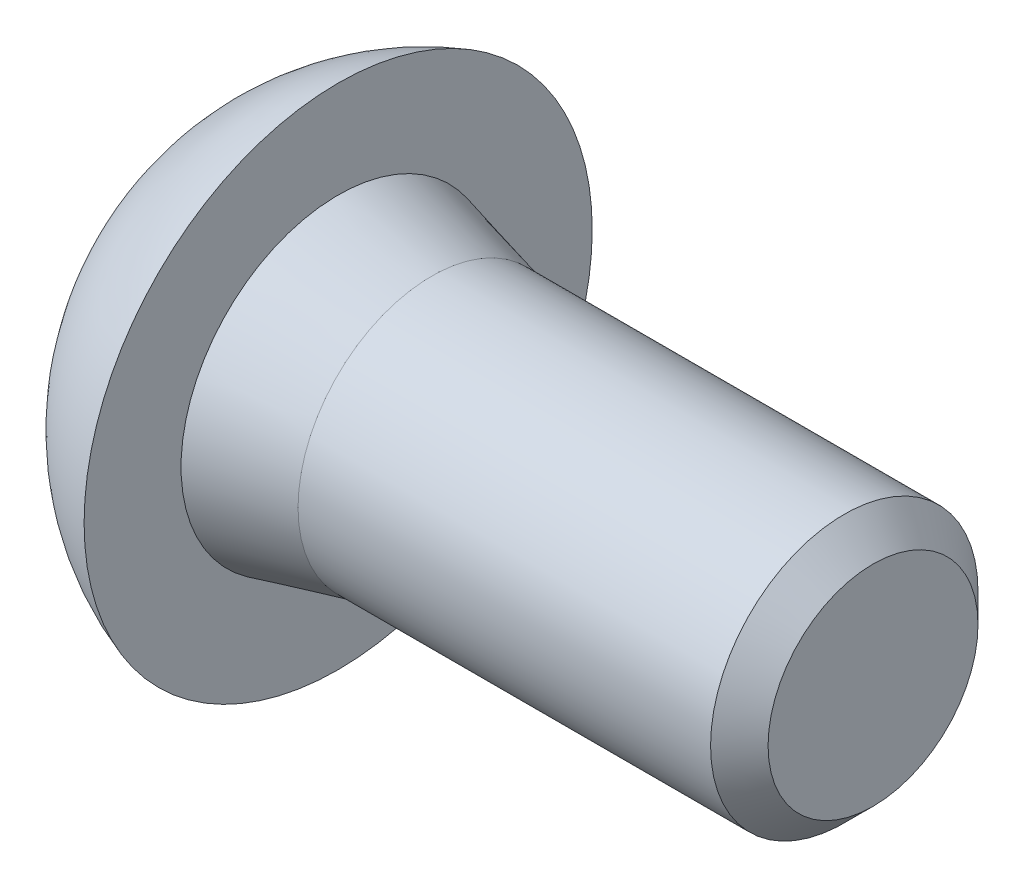
ISO-10303-21;
HEADER;
FILE_DESCRIPTION(('STEP AP214'),'2;1');
FILE_NAME('part.step','',(''),(''),'','','');
FILE_SCHEMA(('AUTOMOTIVE_DESIGN { 1 0 10303 214 1 1 1 1 }'));
ENDSEC;
DATA;
#1=APPLICATION_CONTEXT('core data for automotive mechanical design processes');
#2=APPLICATION_PROTOCOL_DEFINITION('international standard','automotive_design',2000,#1);
#3=PRODUCT_CONTEXT('',#1,'mechanical');
#4=PRODUCT('Part','Part','',(#3));
#5=PRODUCT_RELATED_PRODUCT_CATEGORY('part','',(#4));
#6=PRODUCT_DEFINITION_FORMATION('','',#4);
#7=PRODUCT_DEFINITION_CONTEXT('part definition',#1,'design');
#8=PRODUCT_DEFINITION('design','',#6,#7);
#9=PRODUCT_DEFINITION_SHAPE('','',#8);
#10=(LENGTH_UNIT() NAMED_UNIT(*) SI_UNIT(.MILLI.,.METRE.));
#11=(NAMED_UNIT(*) PLANE_ANGLE_UNIT() SI_UNIT($,.RADIAN.));
#12=(NAMED_UNIT(*) SI_UNIT($,.STERADIAN.) SOLID_ANGLE_UNIT());
#13=UNCERTAINTY_MEASURE_WITH_UNIT(LENGTH_MEASURE(1.E-05),#10,'distance_accuracy_value','');
#14=(GEOMETRIC_REPRESENTATION_CONTEXT(3) GLOBAL_UNCERTAINTY_ASSIGNED_CONTEXT((#13)) GLOBAL_UNIT_ASSIGNED_CONTEXT((#10,
#11,#12)) REPRESENTATION_CONTEXT('',''));
#15=CARTESIAN_POINT('',(0.,0.,0.));
#16=DIRECTION('',(0.,0.,1.));
#17=DIRECTION('',(1.,0.,0.));
#18=AXIS2_PLACEMENT_3D('',#15,#16,#17);
#19=CARTESIAN_POINT('',(-2.19999999999998,1.24999999999964,2.22044604925031E-13));
#20=DIRECTION('',(1.,0.,0.));
#21=DIRECTION('',(0.,0.,-1.));
#22=AXIS2_PLACEMENT_3D('',#19,#20,#21);
#23=PLANE('',#22);
#24=CARTESIAN_POINT('',(-2.19999999999998,0.,0.));
#25=DIRECTION('',(1.,0.,0.));
#26=DIRECTION('',(0.,0.,-1.));
#27=AXIS2_PLACEMENT_3D('',#24,#25,#26);
#28=CIRCLE('',#27,1.9);
#29=CARTESIAN_POINT('',(-2.19999999999998,0.,-1.9));
#30=VERTEX_POINT('',#29);
#31=EDGE_CURVE('E134',#30,#30,#28,.T.);
#32=ORIENTED_EDGE('',*,*,#31,.F.);
#33=EDGE_LOOP('',(#32));
#34=FACE_BOUND('',#33,.T.);
#35=DIRECTION('',(0.,-0.5,0.86602540378444));
#36=VECTOR('',#35,1.);
#37=CARTESIAN_POINT('',(-2.19999999999998,-0.770031754729894,-1.16626587736507));
#38=LINE('',#37,#36);
#39=CARTESIAN_POINT('',(-2.19999999999998,-0.721687836486962,-1.24999999999981));
#40=VERTEX_POINT('',#39);
#41=CARTESIAN_POINT('',(-2.19999999999998,-1.44337567297403,-1.11022302462516E-13));
#42=VERTEX_POINT('',#41);
#43=EDGE_CURVE('E11',#40,#42,#38,.T.);
#44=ORIENTED_EDGE('',*,*,#43,.F.);
#45=DIRECTION('',(0.,-1.,0.));
#46=VECTOR('',#45,1.);
#47=CARTESIAN_POINT('',(-2.19999999999998,1.2500000000002,-1.24999999999981));
#48=LINE('',#47,#46);
#49=CARTESIAN_POINT('',(-2.19999999999998,0.721687836487073,-1.24999999999981));
#50=VERTEX_POINT('',#49);
#51=EDGE_CURVE('E152',#50,#40,#48,.T.);
#52=ORIENTED_EDGE('',*,*,#51,.F.);
#53=DIRECTION('',(0.,-0.5,-0.86602540378444));
#54=VECTOR('',#53,1.);
#55=CARTESIAN_POINT('',(-2.19999999999998,1.39503175473077,-0.0837341226347932));
#56=LINE('',#55,#54);
#57=CARTESIAN_POINT('',(-2.19999999999998,1.44337567297403,2.22044604925031E-13));
#58=VERTEX_POINT('',#57);
#59=EDGE_CURVE('E148',#58,#50,#56,.T.);
#60=ORIENTED_EDGE('',*,*,#59,.F.);
#61=DIRECTION('',(0.,0.5,-0.86602540378444));
#62=VECTOR('',#61,1.);
#63=CARTESIAN_POINT('',(-2.19999999999998,1.39503175473044,0.0837341226349042));
#64=LINE('',#63,#62);
#65=CARTESIAN_POINT('',(-2.19999999999998,0.721687836487295,1.25000000000003));
#66=VERTEX_POINT('',#65);
#67=EDGE_CURVE('E146',#66,#58,#64,.T.);
#68=ORIENTED_EDGE('',*,*,#67,.F.);
#69=DIRECTION('',(0.,1.,0.));
#70=VECTOR('',#69,1.);
#71=CARTESIAN_POINT('',(-2.19999999999998,1.2500000000002,1.25000000000008));
#72=LINE('',#71,#70);
#73=CARTESIAN_POINT('',(-2.19999999999998,-0.72168783648674,1.24999999999992));
#74=VERTEX_POINT('',#73);
#75=EDGE_CURVE('E150',#74,#66,#72,.T.);
#76=ORIENTED_EDGE('',*,*,#75,.F.);
#77=DIRECTION('',(0.,0.5,0.86602540378444));
#78=VECTOR('',#77,1.);
#79=CARTESIAN_POINT('',(-2.19999999999998,-0.770031754730116,1.16626587736562));
#80=LINE('',#79,#78);
#81=EDGE_CURVE('E24',#42,#74,#80,.T.);
#82=ORIENTED_EDGE('',*,*,#81,.F.);
#83=EDGE_LOOP('',(#44,#52,#60,#68,#76,#82));
#84=FACE_BOUND('',#83,.T.);
#85=ADVANCED_FACE('F16',(#34,#84),#23,.F.);
#86=CARTESIAN_POINT('',(1.19489464248757,0.,0.));
#87=DIRECTION('',(1.,0.,0.));
#88=DIRECTION('',(0.,0.,-1.));
#89=AXIS2_PLACEMENT_3D('',#86,#87,#88);
#90=DEGENERATE_TOROIDAL_SURFACE('',#89,0.192753571856456,3.79999999999999,.T.);
#91=ORIENTED_EDGE('',*,*,#31,.T.);
#92=EDGE_LOOP('',(#91));
#93=FACE_BOUND('',#92,.T.);
#94=CARTESIAN_POINT('',(0.,0.,0.));
#95=DIRECTION('',(1.,0.,0.));
#96=DIRECTION('',(0.,0.,-1.));
#97=AXIS2_PLACEMENT_3D('',#94,#95,#96);
#98=CIRCLE('',#97,3.8);
#99=CARTESIAN_POINT('',(0.,0.,-3.8));
#100=VERTEX_POINT('',#99);
#101=EDGE_CURVE('E131',#100,#100,#98,.T.);
#102=ORIENTED_EDGE('',*,*,#101,.F.);
#103=EDGE_LOOP('',(#102));
#104=FACE_BOUND('',#103,.T.);
#105=ADVANCED_FACE('F224',(#93,#104),#90,.T.);
#106=CARTESIAN_POINT('',(0.,3.80000000000069,1.66533453693773E-13));
#107=DIRECTION('',(-1.,0.,0.));
#108=DIRECTION('',(0.,0.,1.));
#109=AXIS2_PLACEMENT_3D('',#106,#107,#108);
#110=PLANE('',#109);
#111=CARTESIAN_POINT('',(0.,0.,0.));
#112=DIRECTION('',(1.,0.,0.));
#113=DIRECTION('',(0.,0.,-1.));
#114=AXIS2_PLACEMENT_3D('',#111,#112,#113);
#115=CIRCLE('',#114,2.35);
#116=CARTESIAN_POINT('',(0.,0.,-2.35));
#117=VERTEX_POINT('',#116);
#118=EDGE_CURVE('E128',#117,#117,#115,.T.);
#119=ORIENTED_EDGE('',*,*,#118,.F.);
#120=EDGE_LOOP('',(#119));
#121=FACE_BOUND('',#120,.T.);
#122=ORIENTED_EDGE('',*,*,#101,.T.);
#123=EDGE_LOOP('',(#122));
#124=FACE_BOUND('',#123,.T.);
#125=ADVANCED_FACE('F231',(#121,#124),#110,.F.);
#126=CARTESIAN_POINT('',(0.,0.,0.));
#127=DIRECTION('',(-1.,0.,0.));
#128=DIRECTION('',(0.,0.,1.));
#129=AXIS2_PLACEMENT_3D('',#126,#127,#128);
#130=CONICAL_SURFACE('',#129,2.35,0.244978663126864);
#131=CARTESIAN_POINT('',(1.39999999999996,0.,0.));
#132=DIRECTION('',(1.,0.,0.));
#133=DIRECTION('',(0.,0.,-1.));
#134=AXIS2_PLACEMENT_3D('',#131,#132,#133);
#135=CIRCLE('',#134,2.);
#136=CARTESIAN_POINT('',(1.39999999999996,0.,-2.));
#137=VERTEX_POINT('',#136);
#138=EDGE_CURVE('E125',#137,#137,#135,.T.);
#139=ORIENTED_EDGE('',*,*,#138,.F.);
#140=EDGE_LOOP('',(#139));
#141=FACE_BOUND('',#140,.T.);
#142=ORIENTED_EDGE('',*,*,#118,.T.);
#143=EDGE_LOOP('',(#142));
#144=FACE_BOUND('',#143,.T.);
#145=ADVANCED_FACE('F337',(#141,#144),#130,.T.);
#146=CARTESIAN_POINT('',(8.00000000000001,0.,0.));
#147=DIRECTION('',(1.,0.,0.));
#148=DIRECTION('',(0.,0.,-1.));
#149=AXIS2_PLACEMENT_3D('',#146,#147,#148);
#150=CYLINDRICAL_SURFACE('',#149,2.);
#151=CARTESIAN_POINT('',(7.5699655,0.,0.));
#152=DIRECTION('',(1.,0.,0.));
#153=DIRECTION('',(0.,0.,-1.));
#154=AXIS2_PLACEMENT_3D('',#151,#152,#153);
#155=CIRCLE('',#154,2.);
#156=CARTESIAN_POINT('',(7.5699655,0.,-2.));
#157=VERTEX_POINT('',#156);
#158=EDGE_CURVE('E117',#157,#157,#155,.T.);
#159=ORIENTED_EDGE('',*,*,#158,.F.);
#160=EDGE_LOOP('',(#159));
#161=FACE_BOUND('',#160,.T.);
#162=ORIENTED_EDGE('',*,*,#138,.T.);
#163=EDGE_LOOP('',(#162));
#164=FACE_BOUND('',#163,.T.);
#165=ADVANCED_FACE('F329',(#161,#164),#150,.T.);
#166=CARTESIAN_POINT('',(7.5699655,0.,0.));
#167=DIRECTION('',(-1.,0.,0.));
#168=DIRECTION('',(0.,0.,1.));
#169=AXIS2_PLACEMENT_3D('',#166,#167,#168);
#170=CONICAL_SURFACE('',#169,2.,0.785398163397451);
#171=CARTESIAN_POINT('',(8.00000000000001,0.,0.));
#172=DIRECTION('',(1.,0.,0.));
#173=DIRECTION('',(0.,0.,-1.));
#174=AXIS2_PLACEMENT_3D('',#171,#172,#173);
#175=CIRCLE('',#174,1.5699655);
#176=CARTESIAN_POINT('',(8.00000000000001,0.,-1.5699655));
#177=VERTEX_POINT('',#176);
#178=EDGE_CURVE('E113',#177,#177,#175,.T.);
#179=ORIENTED_EDGE('',*,*,#178,.F.);
#180=EDGE_LOOP('',(#179));
#181=FACE_BOUND('',#180,.T.);
#182=ORIENTED_EDGE('',*,*,#158,.T.);
#183=EDGE_LOOP('',(#182));
#184=FACE_BOUND('',#183,.T.);
#185=ADVANCED_FACE('F321',(#181,#184),#170,.T.);
#186=CARTESIAN_POINT('',(8.00000000000001,1.56996549999988,0.));
#187=DIRECTION('',(-1.,0.,0.));
#188=DIRECTION('',(0.,0.,1.));
#189=AXIS2_PLACEMENT_3D('',#186,#187,#188);
#190=PLANE('',#189);
#191=ORIENTED_EDGE('',*,*,#178,.T.);
#192=EDGE_LOOP('',(#191));
#193=FACE_BOUND('',#192,.T.);
#194=ADVANCED_FACE('F315',(#193),#190,.F.);
#195=CARTESIAN_POINT('',(-0.900000000000012,0.,0.));
#196=DIRECTION('',(1.,0.,0.));
#197=DIRECTION('',(0.,0.,-1.));
#198=AXIS2_PLACEMENT_3D('',#195,#196,#197);
#199=PLANE('',#198);
#200=DIRECTION('',(0.,1.,0.));
#201=VECTOR('',#200,1.);
#202=CARTESIAN_POINT('',(-0.900000000000012,-0.721687836486962,-1.24999999999981));
#203=LINE('',#202,#201);
#204=CARTESIAN_POINT('',(-0.900000000000012,-0.721687836486962,-1.24999999999981));
#205=VERTEX_POINT('',#204);
#206=CARTESIAN_POINT('',(-0.900000000000012,0.,-1.24999999999975));
#207=VERTEX_POINT('',#206);
#208=EDGE_CURVE('E31',#205,#207,#203,.T.);
#209=ORIENTED_EDGE('',*,*,#208,.F.);
#210=DIRECTION('',(0.,0.5,-0.86602540378444));
#211=VECTOR('',#210,1.);
#212=CARTESIAN_POINT('',(-0.900000000000012,-1.44337567297403,0.));
#213=LINE('',#212,#211);
#214=CARTESIAN_POINT('',(-0.900000000000012,-1.08253175473016,-0.624999999999876));
#215=VERTEX_POINT('',#214);
#216=EDGE_CURVE('E107',#215,#205,#213,.T.);
#217=ORIENTED_EDGE('',*,*,#216,.F.);
#218=CARTESIAN_POINT('',(-0.900000000000012,0.,0.));
#219=DIRECTION('',(1.,0.,0.));
#220=DIRECTION('',(0.,0.,-1.));
#221=AXIS2_PLACEMENT_3D('',#218,#219,#220);
#222=CIRCLE('',#221,1.25);
#223=EDGE_CURVE('E196',#215,#207,#222,.T.);
#224=ORIENTED_EDGE('',*,*,#223,.T.);
#225=EDGE_LOOP('',(#209,#217,#224));
#226=FACE_BOUND('',#225,.T.);
#227=ADVANCED_FACE('F199',(#226),#199,.F.);
#228=CARTESIAN_POINT('',(-0.900000000000012,-1.44337567297403,0.));
#229=VERTEX_POINT('',#228);
#230=EDGE_CURVE('E189',#229,#215,#213,.T.);
#231=ORIENTED_EDGE('',*,*,#230,.F.);
#232=DIRECTION('',(0.,-0.5,-0.86602540378444));
#233=VECTOR('',#232,1.);
#234=CARTESIAN_POINT('',(-0.900000000000012,-0.72168783648674,1.24999999999992));
#235=LINE('',#234,#233);
#236=CARTESIAN_POINT('',(-0.900000000000012,-1.08253175473061,0.625000000000153));
#237=VERTEX_POINT('',#236);
#238=EDGE_CURVE('E108',#237,#229,#235,.T.);
#239=ORIENTED_EDGE('',*,*,#238,.F.);
#240=EDGE_CURVE('E194',#237,#215,#222,.T.);
#241=ORIENTED_EDGE('',*,*,#240,.T.);
#242=EDGE_LOOP('',(#231,#239,#241));
#243=FACE_BOUND('',#242,.T.);
#244=ADVANCED_FACE('F193',(#243),#199,.F.);
#245=CARTESIAN_POINT('',(-0.900000000000012,-0.72168783648674,1.24999999999992));
#246=VERTEX_POINT('',#245);
#247=EDGE_CURVE('E101',#246,#237,#235,.T.);
#248=ORIENTED_EDGE('',*,*,#247,.F.);
#249=DIRECTION('',(0.,-1.,0.));
#250=VECTOR('',#249,1.);
#251=CARTESIAN_POINT('',(-0.900000000000012,0.721687836487295,1.25000000000003));
#252=LINE('',#251,#250);
#253=CARTESIAN_POINT('',(-0.900000000000012,3.33066907387547E-13,1.2500000000002));
#254=VERTEX_POINT('',#253);
#255=EDGE_CURVE('E89',#254,#246,#252,.T.);
#256=ORIENTED_EDGE('',*,*,#255,.F.);
#257=EDGE_CURVE('E103',#254,#237,#222,.T.);
#258=ORIENTED_EDGE('',*,*,#257,.T.);
#259=EDGE_LOOP('',(#248,#256,#258));
#260=FACE_BOUND('',#259,.T.);
#261=ADVANCED_FACE('F102',(#260),#199,.F.);
#262=CARTESIAN_POINT('',(-0.900000000000012,0.721687836487295,1.25000000000003));
#263=VERTEX_POINT('',#262);
#264=EDGE_CURVE('E96',#263,#254,#252,.T.);
#265=ORIENTED_EDGE('',*,*,#264,.F.);
#266=DIRECTION('',(0.,-0.5,0.86602540378444));
#267=VECTOR('',#266,1.);
#268=CARTESIAN_POINT('',(-0.900000000000012,1.44337567297403,2.22044604925031E-13));
#269=LINE('',#268,#267);
#270=CARTESIAN_POINT('',(-0.900000000000012,1.08253175473061,0.625000000000153));
#271=VERTEX_POINT('',#270);
#272=EDGE_CURVE('E175',#271,#263,#269,.T.);
#273=ORIENTED_EDGE('',*,*,#272,.F.);
#274=EDGE_CURVE('E39',#271,#254,#222,.T.);
#275=ORIENTED_EDGE('',*,*,#274,.T.);
#276=EDGE_LOOP('',(#265,#273,#275));
#277=FACE_BOUND('',#276,.T.);
#278=ADVANCED_FACE('F294',(#277),#199,.F.);
#279=CARTESIAN_POINT('',(-0.900000000000012,1.44337567297403,2.22044604925031E-13));
#280=VERTEX_POINT('',#279);
#281=EDGE_CURVE('E177',#280,#271,#269,.T.);
#282=ORIENTED_EDGE('',*,*,#281,.F.);
#283=DIRECTION('',(0.,0.5,0.86602540378444));
#284=VECTOR('',#283,1.);
#285=CARTESIAN_POINT('',(-0.900000000000012,0.721687836487073,-1.24999999999981));
#286=LINE('',#285,#284);
#287=CARTESIAN_POINT('',(-0.900000000000012,1.08253175473116,-0.62499999999982));
#288=VERTEX_POINT('',#287);
#289=EDGE_CURVE('E186',#288,#280,#286,.T.);
#290=ORIENTED_EDGE('',*,*,#289,.F.);
#291=EDGE_CURVE('E138',#288,#271,#222,.T.);
#292=ORIENTED_EDGE('',*,*,#291,.T.);
#293=EDGE_LOOP('',(#282,#290,#292));
#294=FACE_BOUND('',#293,.T.);
#295=ADVANCED_FACE('F210',(#294),#199,.F.);
#296=CARTESIAN_POINT('',(-0.900000000000012,0.721687836487073,-1.24999999999981));
#297=VERTEX_POINT('',#296);
#298=EDGE_CURVE('E183',#297,#288,#286,.T.);
#299=ORIENTED_EDGE('',*,*,#298,.F.);
#300=EDGE_CURVE('E188',#207,#297,#203,.T.);
#301=ORIENTED_EDGE('',*,*,#300,.F.);
#302=EDGE_CURVE('E137',#207,#288,#222,.T.);
#303=ORIENTED_EDGE('',*,*,#302,.T.);
#304=EDGE_LOOP('',(#299,#301,#303));
#305=FACE_BOUND('',#304,.T.);
#306=ADVANCED_FACE('F207',(#305),#199,.F.);
#307=CARTESIAN_POINT('',(-0.900000000000012,0.721687836487295,1.25000000000003));
#308=DIRECTION('',(0.,0.,-1.));
#309=DIRECTION('',(-1.,0.,0.));
#310=AXIS2_PLACEMENT_3D('',#307,#308,#309);
#311=PLANE('',#310);
#312=ORIENTED_EDGE('',*,*,#264,.T.);
#313=ORIENTED_EDGE('',*,*,#255,.T.);
#314=DIRECTION('',(-1.,0.,0.));
#315=VECTOR('',#314,1.);
#316=CARTESIAN_POINT('',(-0.900000000000012,-0.72168783648674,1.24999999999992));
#317=LINE('',#316,#315);
#318=EDGE_CURVE('E93',#246,#74,#317,.T.);
#319=ORIENTED_EDGE('',*,*,#318,.T.);
#320=ORIENTED_EDGE('',*,*,#75,.T.);
#321=DIRECTION('',(-1.,0.,0.));
#322=VECTOR('',#321,1.);
#323=CARTESIAN_POINT('',(-0.900000000000012,0.721687836487295,1.25000000000003));
#324=LINE('',#323,#322);
#325=EDGE_CURVE('E169',#263,#66,#324,.T.);
#326=ORIENTED_EDGE('',*,*,#325,.F.);
#327=EDGE_LOOP('',(#312,#313,#319,#320,#326));
#328=FACE_BOUND('',#327,.T.);
#329=ADVANCED_FACE('F91',(#328),#311,.T.);
#330=CARTESIAN_POINT('',(-0.900000000000012,-0.72168783648674,1.24999999999992));
#331=DIRECTION('',(0.,0.866025403784438,-0.500000000000001));
#332=DIRECTION('',(0.,0.5,0.86602540378444));
#333=AXIS2_PLACEMENT_3D('',#330,#331,#332);
#334=PLANE('',#333);
#335=ORIENTED_EDGE('',*,*,#247,.T.);
#336=ORIENTED_EDGE('',*,*,#238,.T.);
#337=DIRECTION('',(-1.,0.,0.));
#338=VECTOR('',#337,1.);
#339=CARTESIAN_POINT('',(-0.900000000000012,-1.44337567297403,0.));
#340=LINE('',#339,#338);
#341=EDGE_CURVE('E114',#229,#42,#340,.T.);
#342=ORIENTED_EDGE('',*,*,#341,.T.);
#343=ORIENTED_EDGE('',*,*,#81,.T.);
#344=ORIENTED_EDGE('',*,*,#318,.F.);
#345=EDGE_LOOP('',(#335,#336,#342,#343,#344));
#346=FACE_BOUND('',#345,.T.);
#347=ADVANCED_FACE('F110',(#346),#334,.T.);
#348=CARTESIAN_POINT('',(-0.900000000000012,-1.44337567297403,0.));
#349=DIRECTION('',(0.,0.866025403784439,0.500000000000001));
#350=DIRECTION('',(0.,-0.5,0.86602540378444));
#351=AXIS2_PLACEMENT_3D('',#348,#349,#350);
#352=PLANE('',#351);
#353=ORIENTED_EDGE('',*,*,#230,.T.);
#354=ORIENTED_EDGE('',*,*,#216,.T.);
#355=DIRECTION('',(-1.,0.,0.));
#356=VECTOR('',#355,1.);
#357=CARTESIAN_POINT('',(-0.900000000000012,-0.721687836486962,-1.24999999999981));
#358=LINE('',#357,#356);
#359=EDGE_CURVE('E119',#205,#40,#358,.T.);
#360=ORIENTED_EDGE('',*,*,#359,.T.);
#361=ORIENTED_EDGE('',*,*,#43,.T.);
#362=ORIENTED_EDGE('',*,*,#341,.F.);
#363=EDGE_LOOP('',(#353,#354,#360,#361,#362));
#364=FACE_BOUND('',#363,.T.);
#365=ADVANCED_FACE('F164',(#364),#352,.T.);
#366=CARTESIAN_POINT('',(-0.900000000000012,-0.721687836486962,-1.24999999999981));
#367=DIRECTION('',(0.,0.,1.));
#368=DIRECTION('',(1.,0.,0.));
#369=AXIS2_PLACEMENT_3D('',#366,#367,#368);
#370=PLANE('',#369);
#371=ORIENTED_EDGE('',*,*,#208,.T.);
#372=ORIENTED_EDGE('',*,*,#300,.T.);
#373=DIRECTION('',(-1.,0.,0.));
#374=VECTOR('',#373,1.);
#375=CARTESIAN_POINT('',(-0.900000000000012,0.721687836487073,-1.24999999999981));
#376=LINE('',#375,#374);
#377=EDGE_CURVE('E158',#297,#50,#376,.T.);
#378=ORIENTED_EDGE('',*,*,#377,.T.);
#379=ORIENTED_EDGE('',*,*,#51,.T.);
#380=ORIENTED_EDGE('',*,*,#359,.F.);
#381=EDGE_LOOP('',(#371,#372,#378,#379,#380));
#382=FACE_BOUND('',#381,.T.);
#383=ADVANCED_FACE('F156',(#382),#370,.T.);
#384=CARTESIAN_POINT('',(-0.900000000000012,0.721687836487073,-1.24999999999981));
#385=DIRECTION('',(0.,-0.866025403784438,0.500000000000001));
#386=DIRECTION('',(0.,-0.5,-0.86602540378444));
#387=AXIS2_PLACEMENT_3D('',#384,#385,#386);
#388=PLANE('',#387);
#389=ORIENTED_EDGE('',*,*,#298,.T.);
#390=ORIENTED_EDGE('',*,*,#289,.T.);
#391=DIRECTION('',(-1.,0.,0.));
#392=VECTOR('',#391,1.);
#393=CARTESIAN_POINT('',(-0.900000000000012,1.44337567297403,2.22044604925031E-13));
#394=LINE('',#393,#392);
#395=EDGE_CURVE('E176',#280,#58,#394,.T.);
#396=ORIENTED_EDGE('',*,*,#395,.T.);
#397=ORIENTED_EDGE('',*,*,#59,.T.);
#398=ORIENTED_EDGE('',*,*,#377,.F.);
#399=EDGE_LOOP('',(#389,#390,#396,#397,#398));
#400=FACE_BOUND('',#399,.T.);
#401=ADVANCED_FACE('F212',(#400),#388,.T.);
#402=CARTESIAN_POINT('',(-0.900000000000012,1.44337567297403,2.22044604925031E-13));
#403=DIRECTION('',(0.,-0.866025403784439,-0.500000000000001));
#404=DIRECTION('',(0.,0.5,-0.86602540378444));
#405=AXIS2_PLACEMENT_3D('',#402,#403,#404);
#406=PLANE('',#405);
#407=ORIENTED_EDGE('',*,*,#281,.T.);
#408=ORIENTED_EDGE('',*,*,#272,.T.);
#409=ORIENTED_EDGE('',*,*,#325,.T.);
#410=ORIENTED_EDGE('',*,*,#67,.T.);
#411=ORIENTED_EDGE('',*,*,#395,.F.);
#412=EDGE_LOOP('',(#407,#408,#409,#410,#411));
#413=FACE_BOUND('',#412,.T.);
#414=ADVANCED_FACE('F172',(#413),#406,.T.);
#415=CARTESIAN_POINT('',(-1.55000000000005,0.,0.));
#416=DIRECTION('',(1.,0.,0.));
#417=DIRECTION('',(0.,0.,-1.));
#418=AXIS2_PLACEMENT_3D('',#415,#416,#417);
#419=PLANE('',#418);
#420=CARTESIAN_POINT('',(-1.55000000000005,0.,0.));
#421=DIRECTION('',(1.,0.,0.));
#422=DIRECTION('',(0.,0.,-1.));
#423=AXIS2_PLACEMENT_3D('',#420,#421,#422);
#424=CIRCLE('',#423,0.55);
#425=CARTESIAN_POINT('',(-1.55000000000005,0.,-0.550000000000001));
#426=VERTEX_POINT('',#425);
#427=EDGE_CURVE('E143',#426,#426,#424,.T.);
#428=ORIENTED_EDGE('',*,*,#427,.F.);
#429=EDGE_LOOP('',(#428));
#430=FACE_BOUND('',#429,.T.);
#431=ADVANCED_FACE('F18',(#430),#419,.F.);
#432=CARTESIAN_POINT('',(8.00000000000001,0.,0.));
#433=DIRECTION('',(1.,0.,0.));
#434=DIRECTION('',(0.,0.,-1.));
#435=AXIS2_PLACEMENT_3D('',#432,#433,#434);
#436=CYLINDRICAL_SURFACE('',#435,0.55);
#437=CARTESIAN_POINT('',(-0.49585481156722,0.,0.));
#438=DIRECTION('',(1.,0.,0.));
#439=DIRECTION('',(0.,0.,-1.));
#440=AXIS2_PLACEMENT_3D('',#437,#438,#439);
#441=CIRCLE('',#440,0.55);
#442=CARTESIAN_POINT('',(-0.49585481156722,0.,-0.550000000000001));
#443=VERTEX_POINT('',#442);
#444=EDGE_CURVE('E140',#443,#443,#441,.T.);
#445=ORIENTED_EDGE('',*,*,#444,.F.);
#446=EDGE_LOOP('',(#445));
#447=FACE_BOUND('',#446,.T.);
#448=ORIENTED_EDGE('',*,*,#427,.T.);
#449=EDGE_LOOP('',(#448));
#450=FACE_BOUND('',#449,.T.);
#451=ADVANCED_FACE('F238',(#447,#450),#436,.T.);
#452=CARTESIAN_POINT('',(-0.49585481156722,0.,0.));
#453=DIRECTION('',(-1.,0.,0.));
#454=DIRECTION('',(0.,0.,1.));
#455=AXIS2_PLACEMENT_3D('',#452,#453,#454);
#456=CONICAL_SURFACE('',#455,0.55,1.0471975511966);
#457=ORIENTED_EDGE('',*,*,#291,.F.);
#458=ORIENTED_EDGE('',*,*,#302,.F.);
#459=ORIENTED_EDGE('',*,*,#223,.F.);
#460=ORIENTED_EDGE('',*,*,#240,.F.);
#461=ORIENTED_EDGE('',*,*,#257,.F.);
#462=ORIENTED_EDGE('',*,*,#274,.F.);
#463=EDGE_LOOP('',(#457,#458,#459,#460,#461,#462));
#464=FACE_BOUND('',#463,.T.);
#465=ORIENTED_EDGE('',*,*,#444,.T.);
#466=EDGE_LOOP('',(#465));
#467=FACE_BOUND('',#466,.T.);
#468=ADVANCED_FACE('F202',(#464,#467),#456,.F.);
#469=CLOSED_SHELL('',(#85,#105,#125,#145,#165,#185,#194,#227,#244,#261,#278,#295,#306,#329,#347,
#365,#383,#401,#414,#431,#451,#468));
#470=MANIFOLD_SOLID_BREP('B1',#469);
#471=ADVANCED_BREP_SHAPE_REPRESENTATION('',(#18,#470),#14);
#472=SHAPE_DEFINITION_REPRESENTATION(#9,#471);
ENDSEC;
END-ISO-10303-21;
